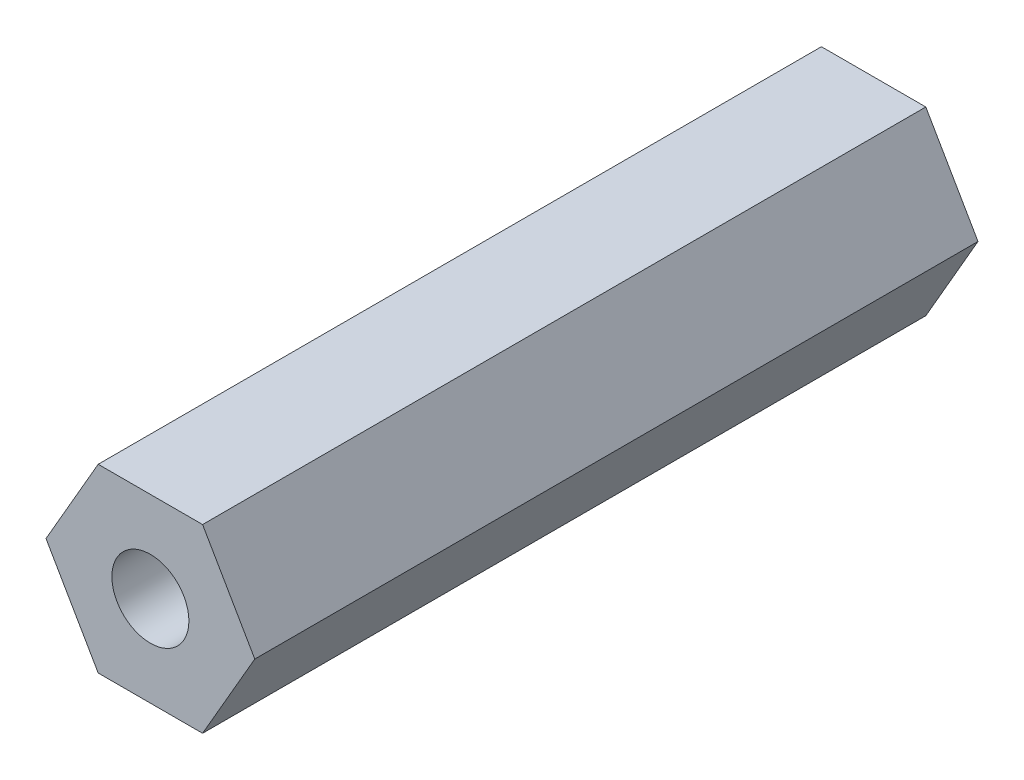
ISO-10303-21;
HEADER;
FILE_DESCRIPTION(('STEP AP214'),'2;1');
FILE_NAME('part.step','',(''),(''),'','','');
FILE_SCHEMA(('AUTOMOTIVE_DESIGN { 1 0 10303 214 1 1 1 1 }'));
ENDSEC;
DATA;
#1=APPLICATION_CONTEXT('core data for automotive mechanical design processes');
#2=APPLICATION_PROTOCOL_DEFINITION('international standard','automotive_design',2000,#1);
#3=PRODUCT_CONTEXT('',#1,'mechanical');
#4=PRODUCT('Part','Part','',(#3));
#5=PRODUCT_RELATED_PRODUCT_CATEGORY('part','',(#4));
#6=PRODUCT_DEFINITION_FORMATION('','',#4);
#7=PRODUCT_DEFINITION_CONTEXT('part definition',#1,'design');
#8=PRODUCT_DEFINITION('design','',#6,#7);
#9=PRODUCT_DEFINITION_SHAPE('','',#8);
#10=(LENGTH_UNIT() NAMED_UNIT(*) SI_UNIT(.MILLI.,.METRE.));
#11=(NAMED_UNIT(*) PLANE_ANGLE_UNIT() SI_UNIT($,.RADIAN.));
#12=(NAMED_UNIT(*) SI_UNIT($,.STERADIAN.) SOLID_ANGLE_UNIT());
#13=UNCERTAINTY_MEASURE_WITH_UNIT(LENGTH_MEASURE(1.E-05),#10,'distance_accuracy_value','');
#14=(GEOMETRIC_REPRESENTATION_CONTEXT(3) GLOBAL_UNCERTAINTY_ASSIGNED_CONTEXT((#13)) GLOBAL_UNIT_ASSIGNED_CONTEXT((#10,
#11,#12)) REPRESENTATION_CONTEXT('',''));
#15=CARTESIAN_POINT('',(0.,0.,0.));
#16=DIRECTION('',(0.,0.,1.));
#17=DIRECTION('',(1.,0.,0.));
#18=AXIS2_PLACEMENT_3D('',#15,#16,#17);
#19=CARTESIAN_POINT('',(3.66617420935412,-6.35000000000001,25.4));
#20=DIRECTION('',(-0.866025403784439,0.5,0.));
#21=DIRECTION('',(-0.5,-0.866025403784439,0.));
#22=AXIS2_PLACEMENT_3D('',#19,#20,#21);
#23=PLANE('',#22);
#24=DIRECTION('',(0.5,0.866025403784439,0.));
#25=VECTOR('',#24,1.);
#26=CARTESIAN_POINT('',(3.66617420935412,-6.35000000000001,-25.4));
#27=LINE('',#26,#25);
#28=CARTESIAN_POINT('',(3.66617420935412,-6.35000000000001,-25.4));
#29=VERTEX_POINT('',#28);
#30=CARTESIAN_POINT('',(7.33234841870824,0.,-25.4));
#31=VERTEX_POINT('',#30);
#32=EDGE_CURVE('E120',#29,#31,#27,.T.);
#33=ORIENTED_EDGE('',*,*,#32,.T.);
#34=DIRECTION('',(0.,0.,-1.));
#35=VECTOR('',#34,1.);
#36=CARTESIAN_POINT('',(7.33234841870824,0.,25.4));
#37=LINE('',#36,#35);
#38=CARTESIAN_POINT('',(7.33234841870824,0.,25.4));
#39=VERTEX_POINT('',#38);
#40=EDGE_CURVE('E11',#39,#31,#37,.T.);
#41=ORIENTED_EDGE('',*,*,#40,.F.);
#42=DIRECTION('',(0.5,0.866025403784439,0.));
#43=VECTOR('',#42,1.);
#44=CARTESIAN_POINT('',(3.66617420935412,-6.35000000000001,25.4));
#45=LINE('',#44,#43);
#46=CARTESIAN_POINT('',(3.66617420935412,-6.35000000000001,25.4));
#47=VERTEX_POINT('',#46);
#48=EDGE_CURVE('E131',#47,#39,#45,.T.);
#49=ORIENTED_EDGE('',*,*,#48,.F.);
#50=DIRECTION('',(0.,0.,-1.));
#51=VECTOR('',#50,1.);
#52=CARTESIAN_POINT('',(3.66617420935412,-6.35000000000001,25.4));
#53=LINE('',#52,#51);
#54=EDGE_CURVE('E116',#47,#29,#53,.T.);
#55=ORIENTED_EDGE('',*,*,#54,.T.);
#56=EDGE_LOOP('',(#33,#41,#49,#55));
#57=FACE_BOUND('',#56,.T.);
#58=ADVANCED_FACE('F33',(#57),#23,.F.);
#59=CARTESIAN_POINT('',(7.33234841870824,0.,25.4));
#60=DIRECTION('',(-0.866025403784439,-0.5,0.));
#61=DIRECTION('',(0.5,-0.866025403784439,0.));
#62=AXIS2_PLACEMENT_3D('',#59,#60,#61);
#63=PLANE('',#62);
#64=DIRECTION('',(-0.5,0.866025403784439,0.));
#65=VECTOR('',#64,1.);
#66=CARTESIAN_POINT('',(7.33234841870824,0.,-25.4));
#67=LINE('',#66,#65);
#68=CARTESIAN_POINT('',(3.66617420935411,6.35000000000001,-25.4));
#69=VERTEX_POINT('',#68);
#70=EDGE_CURVE('E123',#31,#69,#67,.T.);
#71=ORIENTED_EDGE('',*,*,#70,.T.);
#72=DIRECTION('',(0.,0.,-1.));
#73=VECTOR('',#72,1.);
#74=CARTESIAN_POINT('',(3.66617420935411,6.35000000000001,25.4));
#75=LINE('',#74,#73);
#76=CARTESIAN_POINT('',(3.66617420935411,6.35000000000001,25.4));
#77=VERTEX_POINT('',#76);
#78=EDGE_CURVE('E41',#77,#69,#75,.T.);
#79=ORIENTED_EDGE('',*,*,#78,.F.);
#80=DIRECTION('',(-0.5,0.866025403784439,0.));
#81=VECTOR('',#80,1.);
#82=CARTESIAN_POINT('',(7.33234841870824,0.,25.4));
#83=LINE('',#82,#81);
#84=EDGE_CURVE('E87',#39,#77,#83,.T.);
#85=ORIENTED_EDGE('',*,*,#84,.F.);
#86=ORIENTED_EDGE('',*,*,#40,.T.);
#87=EDGE_LOOP('',(#71,#79,#85,#86));
#88=FACE_BOUND('',#87,.T.);
#89=ADVANCED_FACE('F156',(#88),#63,.F.);
#90=CARTESIAN_POINT('',(3.66617420935411,6.35000000000001,25.4));
#91=DIRECTION('',(0.,-1.,0.));
#92=DIRECTION('',(1.,0.,0.));
#93=AXIS2_PLACEMENT_3D('',#90,#91,#92);
#94=PLANE('',#93);
#95=DIRECTION('',(-1.,0.,0.));
#96=VECTOR('',#95,1.);
#97=CARTESIAN_POINT('',(3.66617420935411,6.35000000000001,-25.4));
#98=LINE('',#97,#96);
#99=CARTESIAN_POINT('',(-3.66617420935413,6.35000000000001,-25.4));
#100=VERTEX_POINT('',#99);
#101=EDGE_CURVE('E126',#69,#100,#98,.T.);
#102=ORIENTED_EDGE('',*,*,#101,.T.);
#103=DIRECTION('',(0.,0.,-1.));
#104=VECTOR('',#103,1.);
#105=CARTESIAN_POINT('',(-3.66617420935413,6.35000000000001,25.4));
#106=LINE('',#105,#104);
#107=CARTESIAN_POINT('',(-3.66617420935413,6.35000000000001,25.4));
#108=VERTEX_POINT('',#107);
#109=EDGE_CURVE('E111',#108,#100,#106,.T.);
#110=ORIENTED_EDGE('',*,*,#109,.F.);
#111=DIRECTION('',(-1.,0.,0.));
#112=VECTOR('',#111,1.);
#113=CARTESIAN_POINT('',(3.66617420935411,6.35000000000001,25.4));
#114=LINE('',#113,#112);
#115=EDGE_CURVE('E102',#77,#108,#114,.T.);
#116=ORIENTED_EDGE('',*,*,#115,.F.);
#117=ORIENTED_EDGE('',*,*,#78,.T.);
#118=EDGE_LOOP('',(#102,#110,#116,#117));
#119=FACE_BOUND('',#118,.T.);
#120=ADVANCED_FACE('F137',(#119),#94,.F.);
#121=CARTESIAN_POINT('',(-3.66617420935413,6.35000000000001,25.4));
#122=DIRECTION('',(0.866025403784439,-0.5,0.));
#123=DIRECTION('',(0.5,0.866025403784439,0.));
#124=AXIS2_PLACEMENT_3D('',#121,#122,#123);
#125=PLANE('',#124);
#126=DIRECTION('',(-0.5,-0.866025403784439,0.));
#127=VECTOR('',#126,1.);
#128=CARTESIAN_POINT('',(-3.66617420935413,6.35000000000001,-25.4));
#129=LINE('',#128,#127);
#130=CARTESIAN_POINT('',(-7.33234841870826,0.,-25.4));
#131=VERTEX_POINT('',#130);
#132=EDGE_CURVE('E110',#100,#131,#129,.T.);
#133=ORIENTED_EDGE('',*,*,#132,.T.);
#134=DIRECTION('',(0.,0.,-1.));
#135=VECTOR('',#134,1.);
#136=CARTESIAN_POINT('',(-7.33234841870826,0.,25.4));
#137=LINE('',#136,#135);
#138=CARTESIAN_POINT('',(-7.33234841870826,0.,25.4));
#139=VERTEX_POINT('',#138);
#140=EDGE_CURVE('E107',#139,#131,#137,.T.);
#141=ORIENTED_EDGE('',*,*,#140,.F.);
#142=DIRECTION('',(-0.5,-0.866025403784439,0.));
#143=VECTOR('',#142,1.);
#144=CARTESIAN_POINT('',(-3.66617420935413,6.35000000000001,25.4));
#145=LINE('',#144,#143);
#146=EDGE_CURVE('E96',#108,#139,#145,.T.);
#147=ORIENTED_EDGE('',*,*,#146,.F.);
#148=ORIENTED_EDGE('',*,*,#109,.T.);
#149=EDGE_LOOP('',(#133,#141,#147,#148));
#150=FACE_BOUND('',#149,.T.);
#151=ADVANCED_FACE('F108',(#150),#125,.F.);
#152=CARTESIAN_POINT('',(-7.33234841870826,0.,25.4));
#153=DIRECTION('',(0.866025403784438,0.5,0.));
#154=DIRECTION('',(-0.5,0.866025403784439,0.));
#155=AXIS2_PLACEMENT_3D('',#152,#153,#154);
#156=PLANE('',#155);
#157=DIRECTION('',(0.5,-0.866025403784439,0.));
#158=VECTOR('',#157,1.);
#159=CARTESIAN_POINT('',(-7.33234841870826,0.,-25.4));
#160=LINE('',#159,#158);
#161=CARTESIAN_POINT('',(-3.66617420935413,-6.35000000000001,-25.4));
#162=VERTEX_POINT('',#161);
#163=EDGE_CURVE('E73',#131,#162,#160,.T.);
#164=ORIENTED_EDGE('',*,*,#163,.T.);
#165=DIRECTION('',(0.,0.,-1.));
#166=VECTOR('',#165,1.);
#167=CARTESIAN_POINT('',(-3.66617420935413,-6.35000000000001,25.4));
#168=LINE('',#167,#166);
#169=CARTESIAN_POINT('',(-3.66617420935413,-6.35000000000001,25.4));
#170=VERTEX_POINT('',#169);
#171=EDGE_CURVE('E112',#170,#162,#168,.T.);
#172=ORIENTED_EDGE('',*,*,#171,.F.);
#173=DIRECTION('',(0.5,-0.866025403784439,0.));
#174=VECTOR('',#173,1.);
#175=CARTESIAN_POINT('',(-7.33234841870826,0.,25.4));
#176=LINE('',#175,#174);
#177=EDGE_CURVE('E100',#139,#170,#176,.T.);
#178=ORIENTED_EDGE('',*,*,#177,.F.);
#179=ORIENTED_EDGE('',*,*,#140,.T.);
#180=EDGE_LOOP('',(#164,#172,#178,#179));
#181=FACE_BOUND('',#180,.T.);
#182=ADVANCED_FACE('F114',(#181),#156,.F.);
#183=CARTESIAN_POINT('',(-3.66617420935413,-6.35000000000001,25.4));
#184=DIRECTION('',(0.,1.,0.));
#185=DIRECTION('',(-1.,0.,0.));
#186=AXIS2_PLACEMENT_3D('',#183,#184,#185);
#187=PLANE('',#186);
#188=DIRECTION('',(1.,0.,0.));
#189=VECTOR('',#188,1.);
#190=CARTESIAN_POINT('',(-3.66617420935413,-6.35000000000001,-25.4));
#191=LINE('',#190,#189);
#192=EDGE_CURVE('E79',#162,#29,#191,.T.);
#193=ORIENTED_EDGE('',*,*,#192,.T.);
#194=ORIENTED_EDGE('',*,*,#54,.F.);
#195=DIRECTION('',(1.,0.,0.));
#196=VECTOR('',#195,1.);
#197=CARTESIAN_POINT('',(-3.66617420935413,-6.35000000000001,25.4));
#198=LINE('',#197,#196);
#199=EDGE_CURVE('E49',#170,#47,#198,.T.);
#200=ORIENTED_EDGE('',*,*,#199,.F.);
#201=ORIENTED_EDGE('',*,*,#171,.T.);
#202=EDGE_LOOP('',(#193,#194,#200,#201));
#203=FACE_BOUND('',#202,.T.);
#204=ADVANCED_FACE('F144',(#203),#187,.F.);
#205=CARTESIAN_POINT('',(0.,0.,25.4));
#206=DIRECTION('',(0.,0.,1.));
#207=DIRECTION('',(1.,0.,0.));
#208=AXIS2_PLACEMENT_3D('',#205,#206,#207);
#209=PLANE('',#208);
#210=CARTESIAN_POINT('',(0.,0.,25.4));
#211=DIRECTION('',(0.,0.,1.));
#212=DIRECTION('',(1.,0.,0.));
#213=AXIS2_PLACEMENT_3D('',#210,#211,#212);
#214=CIRCLE('',#213,2.7051);
#215=CARTESIAN_POINT('',(2.7051,0.,25.4));
#216=VERTEX_POINT('',#215);
#217=EDGE_CURVE('E244',#216,#216,#214,.T.);
#218=ORIENTED_EDGE('',*,*,#217,.F.);
#219=EDGE_LOOP('',(#218));
#220=FACE_BOUND('',#219,.T.);
#221=ORIENTED_EDGE('',*,*,#48,.T.);
#222=ORIENTED_EDGE('',*,*,#84,.T.);
#223=ORIENTED_EDGE('',*,*,#115,.T.);
#224=ORIENTED_EDGE('',*,*,#146,.T.);
#225=ORIENTED_EDGE('',*,*,#177,.T.);
#226=ORIENTED_EDGE('',*,*,#199,.T.);
#227=EDGE_LOOP('',(#221,#222,#223,#224,#225,#226));
#228=FACE_BOUND('',#227,.T.);
#229=ADVANCED_FACE('F98',(#220,#228),#209,.T.);
#230=CARTESIAN_POINT('',(0.,0.,-25.4));
#231=DIRECTION('',(0.,0.,1.));
#232=DIRECTION('',(1.,0.,0.));
#233=AXIS2_PLACEMENT_3D('',#230,#231,#232);
#234=PLANE('',#233);
#235=CARTESIAN_POINT('',(0.,0.,-25.4));
#236=DIRECTION('',(0.,0.,-1.));
#237=DIRECTION('',(-1.,0.,0.));
#238=AXIS2_PLACEMENT_3D('',#235,#236,#237);
#239=CIRCLE('',#238,2.70509999999999);
#240=CARTESIAN_POINT('',(-2.70509999999999,0.,-25.4));
#241=VERTEX_POINT('',#240);
#242=EDGE_CURVE('E242',#241,#241,#239,.T.);
#243=ORIENTED_EDGE('',*,*,#242,.F.);
#244=EDGE_LOOP('',(#243));
#245=FACE_BOUND('',#244,.T.);
#246=ORIENTED_EDGE('',*,*,#32,.F.);
#247=ORIENTED_EDGE('',*,*,#192,.F.);
#248=ORIENTED_EDGE('',*,*,#163,.F.);
#249=ORIENTED_EDGE('',*,*,#132,.F.);
#250=ORIENTED_EDGE('',*,*,#101,.F.);
#251=ORIENTED_EDGE('',*,*,#70,.F.);
#252=EDGE_LOOP('',(#246,#247,#248,#249,#250,#251));
#253=FACE_BOUND('',#252,.T.);
#254=ADVANCED_FACE('F140',(#245,#253),#234,.F.);
#255=CARTESIAN_POINT('',(0.,0.,3.175));
#256=DIRECTION('',(0.,0.,1.));
#257=DIRECTION('',(1.,0.,0.));
#258=AXIS2_PLACEMENT_3D('',#255,#256,#257);
#259=CONICAL_SURFACE('',#258,2.70509999999999,1.02974425867665);
#260=CARTESIAN_POINT('',(0.,0.,1.54961193946854));
#261=VERTEX_POINT('',#260);
#262=VERTEX_LOOP('',#261);
#263=FACE_BOUND('',#262,.T.);
#264=CARTESIAN_POINT('',(0.,0.,3.175));
#265=DIRECTION('',(0.,0.,1.));
#266=DIRECTION('',(1.,0.,0.));
#267=AXIS2_PLACEMENT_3D('',#264,#265,#266);
#268=CIRCLE('',#267,2.70509999999999);
#269=CARTESIAN_POINT('',(2.70509999999999,0.,3.175));
#270=VERTEX_POINT('',#269);
#271=EDGE_CURVE('E124',#270,#270,#268,.T.);
#272=ORIENTED_EDGE('',*,*,#271,.T.);
#273=EDGE_LOOP('',(#272));
#274=FACE_BOUND('',#273,.T.);
#275=ADVANCED_FACE('F191',(#263,#274),#259,.F.);
#276=CARTESIAN_POINT('',(0.,0.,25.4));
#277=DIRECTION('',(0.,0.,1.));
#278=DIRECTION('',(1.,0.,0.));
#279=AXIS2_PLACEMENT_3D('',#276,#277,#278);
#280=CYLINDRICAL_SURFACE('',#279,2.70509999999999);
#281=ORIENTED_EDGE('',*,*,#271,.F.);
#282=EDGE_LOOP('',(#281));
#283=FACE_BOUND('',#282,.T.);
#284=ORIENTED_EDGE('',*,*,#217,.T.);
#285=EDGE_LOOP('',(#284));
#286=FACE_BOUND('',#285,.T.);
#287=ADVANCED_FACE('F196',(#283,#286),#280,.F.);
#288=CARTESIAN_POINT('',(0.,0.,-3.175));
#289=DIRECTION('',(0.,0.,-1.));
#290=DIRECTION('',(-1.,0.,0.));
#291=AXIS2_PLACEMENT_3D('',#288,#289,#290);
#292=CONICAL_SURFACE('',#291,2.70509999999999,1.02974425867665);
#293=CARTESIAN_POINT('',(0.,0.,-1.54961193946854));
#294=VERTEX_POINT('',#293);
#295=VERTEX_LOOP('',#294);
#296=FACE_BOUND('',#295,.T.);
#297=CARTESIAN_POINT('',(0.,0.,-3.175));
#298=DIRECTION('',(0.,0.,-1.));
#299=DIRECTION('',(-1.,0.,0.));
#300=AXIS2_PLACEMENT_3D('',#297,#298,#299);
#301=CIRCLE('',#300,2.70509999999999);
#302=CARTESIAN_POINT('',(-2.70509999999999,0.,-3.175));
#303=VERTEX_POINT('',#302);
#304=EDGE_CURVE('E239',#303,#303,#301,.T.);
#305=ORIENTED_EDGE('',*,*,#304,.T.);
#306=EDGE_LOOP('',(#305));
#307=FACE_BOUND('',#306,.T.);
#308=ADVANCED_FACE('F206',(#296,#307),#292,.F.);
#309=CARTESIAN_POINT('',(0.,0.,-25.4));
#310=DIRECTION('',(0.,0.,-1.));
#311=DIRECTION('',(-1.,0.,0.));
#312=AXIS2_PLACEMENT_3D('',#309,#310,#311);
#313=CYLINDRICAL_SURFACE('',#312,2.70509999999999);
#314=ORIENTED_EDGE('',*,*,#304,.F.);
#315=EDGE_LOOP('',(#314));
#316=FACE_BOUND('',#315,.T.);
#317=ORIENTED_EDGE('',*,*,#242,.T.);
#318=EDGE_LOOP('',(#317));
#319=FACE_BOUND('',#318,.T.);
#320=ADVANCED_FACE('F222',(#316,#319),#313,.F.);
#321=CLOSED_SHELL('',(#58,#89,#120,#151,#182,#204,#229,#254,#275,#287,#308,#320));
#322=MANIFOLD_SOLID_BREP('B2',#321);
#323=ADVANCED_BREP_SHAPE_REPRESENTATION('',(#18,#322),#14);
#324=SHAPE_DEFINITION_REPRESENTATION(#9,#323);
ENDSEC;
END-ISO-10303-21;
